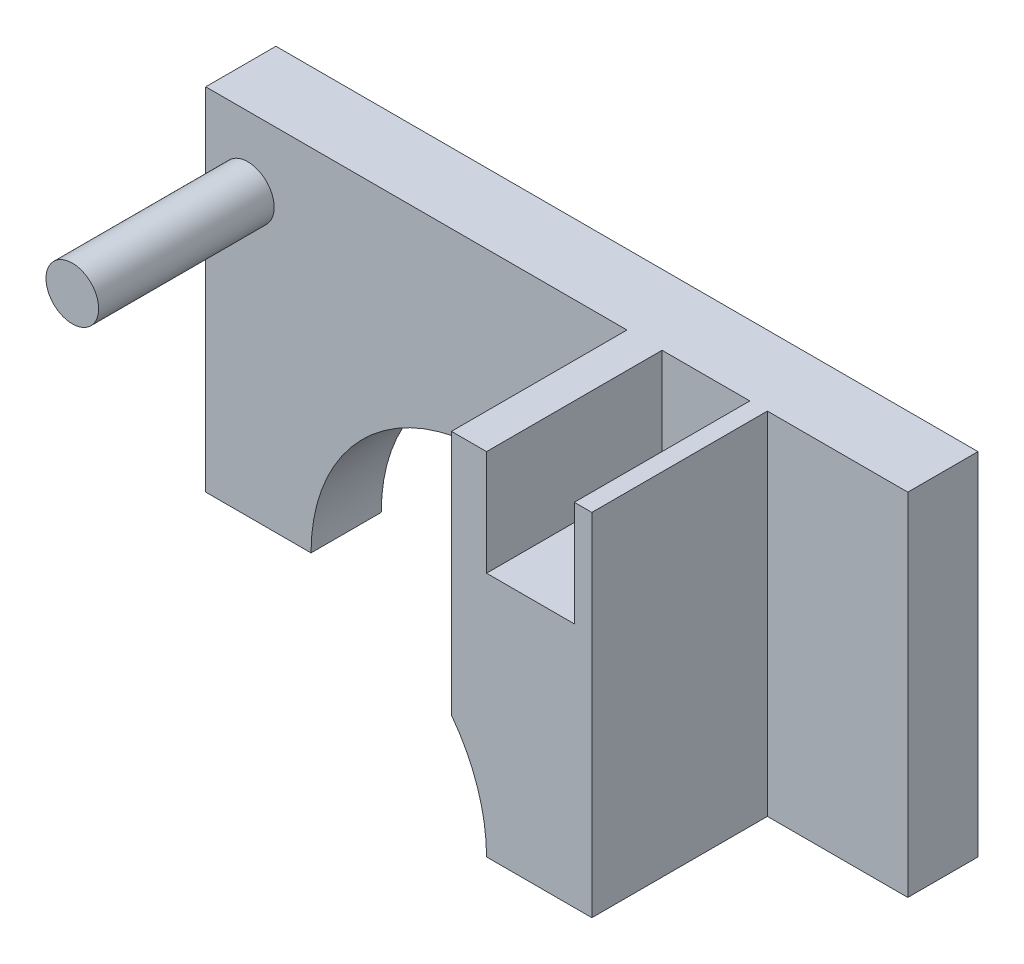
ISO-10303-21;
HEADER;
FILE_DESCRIPTION(('STEP AP214'),'2;1');
FILE_NAME('part.step','',(''),(''),'','','');
FILE_SCHEMA(('AUTOMOTIVE_DESIGN { 1 0 10303 214 1 1 1 1 }'));
ENDSEC;
DATA;
#1=APPLICATION_CONTEXT('core data for automotive mechanical design processes');
#2=APPLICATION_PROTOCOL_DEFINITION('international standard','automotive_design',2000,#1);
#3=PRODUCT_CONTEXT('',#1,'mechanical');
#4=PRODUCT('Part','Part','',(#3));
#5=PRODUCT_RELATED_PRODUCT_CATEGORY('part','',(#4));
#6=PRODUCT_DEFINITION_FORMATION('','',#4);
#7=PRODUCT_DEFINITION_CONTEXT('part definition',#1,'design');
#8=PRODUCT_DEFINITION('design','',#6,#7);
#9=PRODUCT_DEFINITION_SHAPE('','',#8);
#10=(LENGTH_UNIT() NAMED_UNIT(*) SI_UNIT(.MILLI.,.METRE.));
#11=(NAMED_UNIT(*) PLANE_ANGLE_UNIT() SI_UNIT($,.RADIAN.));
#12=(NAMED_UNIT(*) SI_UNIT($,.STERADIAN.) SOLID_ANGLE_UNIT());
#13=UNCERTAINTY_MEASURE_WITH_UNIT(LENGTH_MEASURE(1.E-05),#10,'distance_accuracy_value','');
#14=(GEOMETRIC_REPRESENTATION_CONTEXT(3) GLOBAL_UNCERTAINTY_ASSIGNED_CONTEXT((#13)) GLOBAL_UNIT_ASSIGNED_CONTEXT((#10,
#11,#12)) REPRESENTATION_CONTEXT('',''));
#15=CARTESIAN_POINT('',(0.,0.,0.));
#16=DIRECTION('',(0.,0.,1.));
#17=DIRECTION('',(1.,0.,0.));
#18=AXIS2_PLACEMENT_3D('',#15,#16,#17);
#19=CARTESIAN_POINT('',(0.,0.,20.));
#20=DIRECTION('',(0.,1.,0.));
#21=DIRECTION('',(0.,0.,1.));
#22=AXIS2_PLACEMENT_3D('',#19,#20,#21);
#23=PLANE('',#22);
#24=DIRECTION('',(1.,0.,0.));
#25=VECTOR('',#24,1.);
#26=CARTESIAN_POINT('',(120.,0.,70.));
#27=LINE('',#26,#25);
#28=CARTESIAN_POINT('',(130.,0.,70.));
#29=VERTEX_POINT('',#28);
#30=CARTESIAN_POINT('',(160.,0.,70.));
#31=VERTEX_POINT('',#30);
#32=EDGE_CURVE('E163',#29,#31,#27,.T.);
#33=ORIENTED_EDGE('',*,*,#32,.F.);
#34=DIRECTION('',(0.,0.,-1.));
#35=VECTOR('',#34,1.);
#36=CARTESIAN_POINT('',(130.,0.,211.42135623731));
#37=LINE('',#36,#35);
#38=CARTESIAN_POINT('',(130.,0.,0.));
#39=VERTEX_POINT('',#38);
#40=EDGE_CURVE('E55',#29,#39,#37,.T.);
#41=ORIENTED_EDGE('',*,*,#40,.T.);
#42=DIRECTION('',(1.,0.,0.));
#43=VECTOR('',#42,1.);
#44=CARTESIAN_POINT('',(0.,0.,0.));
#45=LINE('',#44,#43);
#46=CARTESIAN_POINT('',(200.,0.,0.));
#47=VERTEX_POINT('',#46);
#48=EDGE_CURVE('E232',#39,#47,#45,.T.);
#49=ORIENTED_EDGE('',*,*,#48,.T.);
#50=DIRECTION('',(0.,0.,-1.));
#51=VECTOR('',#50,1.);
#52=CARTESIAN_POINT('',(200.,0.,20.));
#53=LINE('',#52,#51);
#54=CARTESIAN_POINT('',(200.,0.,20.));
#55=VERTEX_POINT('',#54);
#56=EDGE_CURVE('E249',#55,#47,#53,.T.);
#57=ORIENTED_EDGE('',*,*,#56,.F.);
#58=DIRECTION('',(1.,0.,0.));
#59=VECTOR('',#58,1.);
#60=CARTESIAN_POINT('',(0.,0.,20.));
#61=LINE('',#60,#59);
#62=CARTESIAN_POINT('',(160.,0.,20.));
#63=VERTEX_POINT('',#62);
#64=EDGE_CURVE('E213',#63,#55,#61,.T.);
#65=ORIENTED_EDGE('',*,*,#64,.F.);
#66=DIRECTION('',(0.,0.,-1.));
#67=VECTOR('',#66,1.);
#68=CARTESIAN_POINT('',(160.,0.,70.));
#69=LINE('',#68,#67);
#70=EDGE_CURVE('E195',#31,#63,#69,.T.);
#71=ORIENTED_EDGE('',*,*,#70,.F.);
#72=EDGE_LOOP('',(#33,#41,#49,#57,#65,#71));
#73=FACE_BOUND('',#72,.T.);
#74=ADVANCED_FACE('F39',(#73),#23,.F.);
#75=CARTESIAN_POINT('',(0.,0.,20.));
#76=DIRECTION('',(0.,0.,-1.));
#77=DIRECTION('',(-1.,0.,0.));
#78=AXIS2_PLACEMENT_3D('',#75,#76,#77);
#79=PLANE('',#78);
#80=DIRECTION('',(0.,1.,0.));
#81=VECTOR('',#80,1.);
#82=CARTESIAN_POINT('',(160.,0.,20.));
#83=LINE('',#82,#81);
#84=CARTESIAN_POINT('',(160.,100.,20.));
#85=VERTEX_POINT('',#84);
#86=EDGE_CURVE('E185',#63,#85,#83,.T.);
#87=ORIENTED_EDGE('',*,*,#86,.F.);
#88=ORIENTED_EDGE('',*,*,#64,.T.);
#89=DIRECTION('',(0.,1.,0.));
#90=VECTOR('',#89,1.);
#91=CARTESIAN_POINT('',(200.,0.,20.));
#92=LINE('',#91,#90);
#93=CARTESIAN_POINT('',(200.,100.,20.));
#94=VERTEX_POINT('',#93);
#95=EDGE_CURVE('E219',#55,#94,#92,.T.);
#96=ORIENTED_EDGE('',*,*,#95,.T.);
#97=DIRECTION('',(-1.,0.,0.));
#98=VECTOR('',#97,1.);
#99=CARTESIAN_POINT('',(0.,100.,20.));
#100=LINE('',#99,#98);
#101=EDGE_CURVE('E223',#94,#85,#100,.T.);
#102=ORIENTED_EDGE('',*,*,#101,.T.);
#103=EDGE_LOOP('',(#87,#88,#96,#102));
#104=FACE_BOUND('',#103,.T.);
#105=ADVANCED_FACE('F337',(#104),#79,.F.);
#106=CARTESIAN_POINT('',(155.,100.,20.));
#107=VERTEX_POINT('',#106);
#108=CARTESIAN_POINT('',(130.,100.,20.));
#109=VERTEX_POINT('',#108);
#110=EDGE_CURVE('E228',#107,#109,#100,.T.);
#111=ORIENTED_EDGE('',*,*,#110,.T.);
#112=DIRECTION('',(0.,-1.,0.));
#113=VECTOR('',#112,1.);
#114=CARTESIAN_POINT('',(130.,100.,20.));
#115=LINE('',#114,#113);
#116=CARTESIAN_POINT('',(130.,70.,20.));
#117=VERTEX_POINT('',#116);
#118=EDGE_CURVE('E173',#109,#117,#115,.T.);
#119=ORIENTED_EDGE('',*,*,#118,.T.);
#120=DIRECTION('',(1.,0.,0.));
#121=VECTOR('',#120,1.);
#122=CARTESIAN_POINT('',(130.,70.,20.));
#123=LINE('',#122,#121);
#124=CARTESIAN_POINT('',(155.,70.,20.));
#125=VERTEX_POINT('',#124);
#126=EDGE_CURVE('E177',#117,#125,#123,.T.);
#127=ORIENTED_EDGE('',*,*,#126,.T.);
#128=DIRECTION('',(0.,-1.,0.));
#129=VECTOR('',#128,1.);
#130=CARTESIAN_POINT('',(155.,100.,20.));
#131=LINE('',#130,#129);
#132=EDGE_CURVE('E181',#107,#125,#131,.T.);
#133=ORIENTED_EDGE('',*,*,#132,.F.);
#134=EDGE_LOOP('',(#111,#119,#127,#133));
#135=FACE_BOUND('',#134,.T.);
#136=ADVANCED_FACE('F326',(#135),#79,.F.);
#137=CARTESIAN_POINT('',(0.,0.,20.));
#138=DIRECTION('',(1.,0.,0.));
#139=DIRECTION('',(0.,0.,-1.));
#140=AXIS2_PLACEMENT_3D('',#137,#138,#139);
#141=PLANE('',#140);
#142=DIRECTION('',(0.,-1.,0.));
#143=VECTOR('',#142,1.);
#144=CARTESIAN_POINT('',(0.,0.,0.));
#145=LINE('',#144,#143);
#146=CARTESIAN_POINT('',(0.,100.,0.));
#147=VERTEX_POINT('',#146);
#148=CARTESIAN_POINT('',(0.,0.,0.));
#149=VERTEX_POINT('',#148);
#150=EDGE_CURVE('E194',#147,#149,#145,.T.);
#151=ORIENTED_EDGE('',*,*,#150,.T.);
#152=DIRECTION('',(0.,0.,-1.));
#153=VECTOR('',#152,1.);
#154=CARTESIAN_POINT('',(0.,0.,20.));
#155=LINE('',#154,#153);
#156=CARTESIAN_POINT('',(0.,0.,20.));
#157=VERTEX_POINT('',#156);
#158=EDGE_CURVE('E48',#157,#149,#155,.T.);
#159=ORIENTED_EDGE('',*,*,#158,.F.);
#160=DIRECTION('',(0.,-1.,0.));
#161=VECTOR('',#160,1.);
#162=CARTESIAN_POINT('',(0.,0.,20.));
#163=LINE('',#162,#161);
#164=CARTESIAN_POINT('',(0.,100.,20.));
#165=VERTEX_POINT('',#164);
#166=EDGE_CURVE('E209',#165,#157,#163,.T.);
#167=ORIENTED_EDGE('',*,*,#166,.F.);
#168=DIRECTION('',(0.,0.,-1.));
#169=VECTOR('',#168,1.);
#170=CARTESIAN_POINT('',(0.,100.,20.));
#171=LINE('',#170,#169);
#172=EDGE_CURVE('E227',#165,#147,#171,.T.);
#173=ORIENTED_EDGE('',*,*,#172,.T.);
#174=EDGE_LOOP('',(#151,#159,#167,#173));
#175=FACE_BOUND('',#174,.T.);
#176=ADVANCED_FACE('F41',(#175),#141,.F.);
#177=CARTESIAN_POINT('',(30.,0.,0.));
#178=VERTEX_POINT('',#177);
#179=EDGE_CURVE('E233',#149,#178,#45,.T.);
#180=ORIENTED_EDGE('',*,*,#179,.T.);
#181=DIRECTION('',(0.,0.,-1.));
#182=VECTOR('',#181,1.);
#183=CARTESIAN_POINT('',(30.,0.,211.42135623731));
#184=LINE('',#183,#182);
#185=CARTESIAN_POINT('',(30.,0.,20.));
#186=VERTEX_POINT('',#185);
#187=EDGE_CURVE('E277',#178,#186,#184,.F.);
#188=ORIENTED_EDGE('',*,*,#187,.T.);
#189=EDGE_CURVE('E215',#157,#186,#61,.T.);
#190=ORIENTED_EDGE('',*,*,#189,.F.);
#191=ORIENTED_EDGE('',*,*,#158,.T.);
#192=EDGE_LOOP('',(#180,#188,#190,#191));
#193=FACE_BOUND('',#192,.T.);
#194=ADVANCED_FACE('F256',(#193),#23,.F.);
#195=CARTESIAN_POINT('',(200.,0.,20.));
#196=DIRECTION('',(-1.,0.,0.));
#197=DIRECTION('',(0.,0.,1.));
#198=AXIS2_PLACEMENT_3D('',#195,#196,#197);
#199=PLANE('',#198);
#200=DIRECTION('',(0.,1.,0.));
#201=VECTOR('',#200,1.);
#202=CARTESIAN_POINT('',(200.,0.,0.));
#203=LINE('',#202,#201);
#204=CARTESIAN_POINT('',(200.,100.,0.));
#205=VERTEX_POINT('',#204);
#206=EDGE_CURVE('E237',#47,#205,#203,.T.);
#207=ORIENTED_EDGE('',*,*,#206,.T.);
#208=DIRECTION('',(0.,0.,-1.));
#209=VECTOR('',#208,1.);
#210=CARTESIAN_POINT('',(200.,100.,20.));
#211=LINE('',#210,#209);
#212=EDGE_CURVE('E245',#94,#205,#211,.T.);
#213=ORIENTED_EDGE('',*,*,#212,.F.);
#214=ORIENTED_EDGE('',*,*,#95,.F.);
#215=ORIENTED_EDGE('',*,*,#56,.T.);
#216=EDGE_LOOP('',(#207,#213,#214,#215));
#217=FACE_BOUND('',#216,.T.);
#218=ADVANCED_FACE('F347',(#217),#199,.F.);
#219=CARTESIAN_POINT('',(0.,100.,20.));
#220=DIRECTION('',(0.,-1.,0.));
#221=DIRECTION('',(0.,0.,-1.));
#222=AXIS2_PLACEMENT_3D('',#219,#220,#221);
#223=PLANE('',#222);
#224=DIRECTION('',(-1.,0.,0.));
#225=VECTOR('',#224,1.);
#226=CARTESIAN_POINT('',(0.,100.,0.));
#227=LINE('',#226,#225);
#228=EDGE_CURVE('E214',#205,#147,#227,.T.);
#229=ORIENTED_EDGE('',*,*,#228,.T.);
#230=ORIENTED_EDGE('',*,*,#172,.F.);
#231=CARTESIAN_POINT('',(120.,100.,20.));
#232=VERTEX_POINT('',#231);
#233=EDGE_CURVE('E222',#232,#165,#100,.T.);
#234=ORIENTED_EDGE('',*,*,#233,.F.);
#235=DIRECTION('',(0.,0.,-1.));
#236=VECTOR('',#235,1.);
#237=CARTESIAN_POINT('',(120.,100.,70.));
#238=LINE('',#237,#236);
#239=CARTESIAN_POINT('',(120.,100.,70.));
#240=VERTEX_POINT('',#239);
#241=EDGE_CURVE('E191',#240,#232,#238,.T.);
#242=ORIENTED_EDGE('',*,*,#241,.F.);
#243=DIRECTION('',(1.,0.,0.));
#244=VECTOR('',#243,1.);
#245=CARTESIAN_POINT('',(120.,100.,70.));
#246=LINE('',#245,#244);
#247=CARTESIAN_POINT('',(130.,100.,70.));
#248=VERTEX_POINT('',#247);
#249=EDGE_CURVE('E160',#240,#248,#246,.T.);
#250=ORIENTED_EDGE('',*,*,#249,.T.);
#251=DIRECTION('',(0.,0.,-1.));
#252=VECTOR('',#251,1.);
#253=CARTESIAN_POINT('',(130.,100.,70.));
#254=LINE('',#253,#252);
#255=EDGE_CURVE('E162',#248,#109,#254,.T.);
#256=ORIENTED_EDGE('',*,*,#255,.T.);
#257=ORIENTED_EDGE('',*,*,#110,.F.);
#258=DIRECTION('',(0.,0.,-1.));
#259=VECTOR('',#258,1.);
#260=CARTESIAN_POINT('',(155.,100.,70.));
#261=LINE('',#260,#259);
#262=CARTESIAN_POINT('',(155.,100.,70.));
#263=VERTEX_POINT('',#262);
#264=EDGE_CURVE('E201',#263,#107,#261,.T.);
#265=ORIENTED_EDGE('',*,*,#264,.F.);
#266=DIRECTION('',(1.,0.,0.));
#267=VECTOR('',#266,1.);
#268=CARTESIAN_POINT('',(155.,100.,70.));
#269=LINE('',#268,#267);
#270=CARTESIAN_POINT('',(160.,100.,70.));
#271=VERTEX_POINT('',#270);
#272=EDGE_CURVE('E295',#263,#271,#269,.T.);
#273=ORIENTED_EDGE('',*,*,#272,.T.);
#274=DIRECTION('',(0.,0.,-1.));
#275=VECTOR('',#274,1.);
#276=CARTESIAN_POINT('',(160.,100.,70.));
#277=LINE('',#276,#275);
#278=EDGE_CURVE('E198',#271,#85,#277,.T.);
#279=ORIENTED_EDGE('',*,*,#278,.T.);
#280=ORIENTED_EDGE('',*,*,#101,.F.);
#281=ORIENTED_EDGE('',*,*,#212,.T.);
#282=EDGE_LOOP('',(#229,#230,#234,#242,#250,#256,#257,#265,#273,#279,#280,#281));
#283=FACE_BOUND('',#282,.T.);
#284=ADVANCED_FACE('F308',(#283),#223,.F.);
#285=CARTESIAN_POINT('',(12.,80.,20.));
#286=DIRECTION('',(0.,0.,-1.));
#287=DIRECTION('',(-1.,0.,0.));
#288=AXIS2_PLACEMENT_3D('',#285,#286,#287);
#289=CIRCLE('',#288,7.5);
#290=CARTESIAN_POINT('',(4.5,80.,20.));
#291=VERTEX_POINT('',#290);
#292=EDGE_CURVE('E11',#291,#291,#289,.F.);
#293=ORIENTED_EDGE('',*,*,#292,.F.);
#294=EDGE_LOOP('',(#293));
#295=FACE_BOUND('',#294,.T.);
#296=ORIENTED_EDGE('',*,*,#189,.T.);
#297=CARTESIAN_POINT('',(80.,0.,20.));
#298=DIRECTION('',(0.,0.,-1.));
#299=DIRECTION('',(-1.,0.,0.));
#300=AXIS2_PLACEMENT_3D('',#297,#298,#299);
#301=CIRCLE('',#300,50.);
#302=CARTESIAN_POINT('',(120.,30.,20.));
#303=VERTEX_POINT('',#302);
#304=EDGE_CURVE('E154',#186,#303,#301,.T.);
#305=ORIENTED_EDGE('',*,*,#304,.T.);
#306=DIRECTION('',(0.,1.,0.));
#307=VECTOR('',#306,1.);
#308=CARTESIAN_POINT('',(120.,0.,20.));
#309=LINE('',#308,#307);
#310=EDGE_CURVE('E63',#303,#232,#309,.T.);
#311=ORIENTED_EDGE('',*,*,#310,.T.);
#312=ORIENTED_EDGE('',*,*,#233,.T.);
#313=ORIENTED_EDGE('',*,*,#166,.T.);
#314=EDGE_LOOP('',(#296,#305,#311,#312,#313));
#315=FACE_BOUND('',#314,.T.);
#316=ADVANCED_FACE('F344',(#295,#315),#79,.F.);
#317=CARTESIAN_POINT('',(0.,0.,0.));
#318=DIRECTION('',(0.,0.,-1.));
#319=DIRECTION('',(-1.,0.,0.));
#320=AXIS2_PLACEMENT_3D('',#317,#318,#319);
#321=PLANE('',#320);
#322=CARTESIAN_POINT('',(80.,0.,0.));
#323=DIRECTION('',(0.,0.,-1.));
#324=DIRECTION('',(-1.,0.,0.));
#325=AXIS2_PLACEMENT_3D('',#322,#323,#324);
#326=CIRCLE('',#325,50.);
#327=EDGE_CURVE('E147',#178,#39,#326,.T.);
#328=ORIENTED_EDGE('',*,*,#327,.F.);
#329=ORIENTED_EDGE('',*,*,#179,.F.);
#330=ORIENTED_EDGE('',*,*,#150,.F.);
#331=ORIENTED_EDGE('',*,*,#228,.F.);
#332=ORIENTED_EDGE('',*,*,#206,.F.);
#333=ORIENTED_EDGE('',*,*,#48,.F.);
#334=EDGE_LOOP('',(#328,#329,#330,#331,#332,#333));
#335=FACE_BOUND('',#334,.T.);
#336=ADVANCED_FACE('F265',(#335),#321,.T.);
#337=CARTESIAN_POINT('',(120.,0.,70.));
#338=DIRECTION('',(-1.,0.,0.));
#339=DIRECTION('',(0.,0.,1.));
#340=AXIS2_PLACEMENT_3D('',#337,#338,#339);
#341=PLANE('',#340);
#342=DIRECTION('',(0.,0.,-1.));
#343=VECTOR('',#342,1.);
#344=CARTESIAN_POINT('',(120.,30.,211.42135623731));
#345=LINE('',#344,#343);
#346=CARTESIAN_POINT('',(120.,30.,70.));
#347=VERTEX_POINT('',#346);
#348=EDGE_CURVE('E142',#347,#303,#345,.T.);
#349=ORIENTED_EDGE('',*,*,#348,.F.);
#350=DIRECTION('',(0.,1.,0.));
#351=VECTOR('',#350,1.);
#352=CARTESIAN_POINT('',(120.,0.,70.));
#353=LINE('',#352,#351);
#354=EDGE_CURVE('E151',#347,#240,#353,.T.);
#355=ORIENTED_EDGE('',*,*,#354,.T.);
#356=ORIENTED_EDGE('',*,*,#241,.T.);
#357=ORIENTED_EDGE('',*,*,#310,.F.);
#358=EDGE_LOOP('',(#349,#355,#356,#357));
#359=FACE_BOUND('',#358,.T.);
#360=ADVANCED_FACE('F150',(#359),#341,.T.);
#361=CARTESIAN_POINT('',(160.,0.,70.));
#362=DIRECTION('',(-1.,0.,0.));
#363=DIRECTION('',(0.,0.,1.));
#364=AXIS2_PLACEMENT_3D('',#361,#362,#363);
#365=PLANE('',#364);
#366=ORIENTED_EDGE('',*,*,#86,.T.);
#367=ORIENTED_EDGE('',*,*,#278,.F.);
#368=DIRECTION('',(0.,1.,0.));
#369=VECTOR('',#368,1.);
#370=CARTESIAN_POINT('',(160.,0.,70.));
#371=LINE('',#370,#369);
#372=EDGE_CURVE('E169',#31,#271,#371,.T.);
#373=ORIENTED_EDGE('',*,*,#372,.F.);
#374=ORIENTED_EDGE('',*,*,#70,.T.);
#375=EDGE_LOOP('',(#366,#367,#373,#374));
#376=FACE_BOUND('',#375,.T.);
#377=ADVANCED_FACE('F304',(#376),#365,.F.);
#378=CARTESIAN_POINT('',(155.,100.,70.));
#379=DIRECTION('',(1.,0.,0.));
#380=DIRECTION('',(0.,0.,-1.));
#381=AXIS2_PLACEMENT_3D('',#378,#379,#380);
#382=PLANE('',#381);
#383=ORIENTED_EDGE('',*,*,#132,.T.);
#384=DIRECTION('',(0.,0.,-1.));
#385=VECTOR('',#384,1.);
#386=CARTESIAN_POINT('',(155.,70.,70.));
#387=LINE('',#386,#385);
#388=CARTESIAN_POINT('',(155.,70.,70.));
#389=VERTEX_POINT('',#388);
#390=EDGE_CURVE('E204',#389,#125,#387,.T.);
#391=ORIENTED_EDGE('',*,*,#390,.F.);
#392=DIRECTION('',(0.,-1.,0.));
#393=VECTOR('',#392,1.);
#394=CARTESIAN_POINT('',(155.,100.,70.));
#395=LINE('',#394,#393);
#396=EDGE_CURVE('E292',#263,#389,#395,.T.);
#397=ORIENTED_EDGE('',*,*,#396,.F.);
#398=ORIENTED_EDGE('',*,*,#264,.T.);
#399=EDGE_LOOP('',(#383,#391,#397,#398));
#400=FACE_BOUND('',#399,.T.);
#401=ADVANCED_FACE('F315',(#400),#382,.F.);
#402=CARTESIAN_POINT('',(130.,70.,70.));
#403=DIRECTION('',(0.,1.,0.));
#404=DIRECTION('',(0.,0.,1.));
#405=AXIS2_PLACEMENT_3D('',#402,#403,#404);
#406=PLANE('',#405);
#407=ORIENTED_EDGE('',*,*,#126,.F.);
#408=DIRECTION('',(0.,0.,-1.));
#409=VECTOR('',#408,1.);
#410=CARTESIAN_POINT('',(130.,70.,70.));
#411=LINE('',#410,#409);
#412=CARTESIAN_POINT('',(130.,70.,70.));
#413=VERTEX_POINT('',#412);
#414=EDGE_CURVE('E167',#413,#117,#411,.T.);
#415=ORIENTED_EDGE('',*,*,#414,.F.);
#416=DIRECTION('',(1.,0.,0.));
#417=VECTOR('',#416,1.);
#418=CARTESIAN_POINT('',(130.,70.,70.));
#419=LINE('',#418,#417);
#420=EDGE_CURVE('E288',#413,#389,#419,.T.);
#421=ORIENTED_EDGE('',*,*,#420,.T.);
#422=ORIENTED_EDGE('',*,*,#390,.T.);
#423=EDGE_LOOP('',(#407,#415,#421,#422));
#424=FACE_BOUND('',#423,.T.);
#425=ADVANCED_FACE('F327',(#424),#406,.T.);
#426=CARTESIAN_POINT('',(130.,100.,70.));
#427=DIRECTION('',(1.,0.,0.));
#428=DIRECTION('',(0.,0.,-1.));
#429=AXIS2_PLACEMENT_3D('',#426,#427,#428);
#430=PLANE('',#429);
#431=ORIENTED_EDGE('',*,*,#118,.F.);
#432=ORIENTED_EDGE('',*,*,#255,.F.);
#433=DIRECTION('',(0.,-1.,0.));
#434=VECTOR('',#433,1.);
#435=CARTESIAN_POINT('',(130.,100.,70.));
#436=LINE('',#435,#434);
#437=EDGE_CURVE('E284',#248,#413,#436,.T.);
#438=ORIENTED_EDGE('',*,*,#437,.T.);
#439=ORIENTED_EDGE('',*,*,#414,.T.);
#440=EDGE_LOOP('',(#431,#432,#438,#439));
#441=FACE_BOUND('',#440,.T.);
#442=ADVANCED_FACE('F320',(#441),#430,.T.);
#443=CARTESIAN_POINT('',(0.,0.,70.));
#444=DIRECTION('',(0.,0.,-1.));
#445=DIRECTION('',(-1.,0.,0.));
#446=AXIS2_PLACEMENT_3D('',#443,#444,#445);
#447=PLANE('',#446);
#448=ORIENTED_EDGE('',*,*,#354,.F.);
#449=CARTESIAN_POINT('',(80.,0.,70.));
#450=DIRECTION('',(0.,0.,-1.));
#451=DIRECTION('',(-1.,0.,0.));
#452=AXIS2_PLACEMENT_3D('',#449,#450,#451);
#453=CIRCLE('',#452,50.);
#454=EDGE_CURVE('E139',#29,#347,#453,.F.);
#455=ORIENTED_EDGE('',*,*,#454,.F.);
#456=ORIENTED_EDGE('',*,*,#32,.T.);
#457=ORIENTED_EDGE('',*,*,#372,.T.);
#458=ORIENTED_EDGE('',*,*,#272,.F.);
#459=ORIENTED_EDGE('',*,*,#396,.T.);
#460=ORIENTED_EDGE('',*,*,#420,.F.);
#461=ORIENTED_EDGE('',*,*,#437,.F.);
#462=ORIENTED_EDGE('',*,*,#249,.F.);
#463=EDGE_LOOP('',(#448,#455,#456,#457,#458,#459,#460,#461,#462));
#464=FACE_BOUND('',#463,.T.);
#465=ADVANCED_FACE('F157',(#464),#447,.F.);
#466=CARTESIAN_POINT('',(80.,0.,211.42135623731));
#467=DIRECTION('',(0.,0.,-1.));
#468=DIRECTION('',(-1.,0.,0.));
#469=AXIS2_PLACEMENT_3D('',#466,#467,#468);
#470=CYLINDRICAL_SURFACE('',#469,50.);
#471=ORIENTED_EDGE('',*,*,#454,.T.);
#472=ORIENTED_EDGE('',*,*,#348,.T.);
#473=ORIENTED_EDGE('',*,*,#304,.F.);
#474=ORIENTED_EDGE('',*,*,#187,.F.);
#475=ORIENTED_EDGE('',*,*,#327,.T.);
#476=ORIENTED_EDGE('',*,*,#40,.F.);
#477=EDGE_LOOP('',(#471,#472,#473,#474,#475,#476));
#478=FACE_BOUND('',#477,.T.);
#479=ADVANCED_FACE('F141',(#478),#470,.F.);
#480=CARTESIAN_POINT('',(12.,80.,70.));
#481=DIRECTION('',(0.,0.,-1.));
#482=DIRECTION('',(-1.,0.,0.));
#483=AXIS2_PLACEMENT_3D('',#480,#481,#482);
#484=CYLINDRICAL_SURFACE('',#483,7.5);
#485=CARTESIAN_POINT('',(12.,80.,70.));
#486=DIRECTION('',(0.,0.,1.));
#487=DIRECTION('',(1.,0.,0.));
#488=AXIS2_PLACEMENT_3D('',#485,#486,#487);
#489=CIRCLE('',#488,7.5);
#490=CARTESIAN_POINT('',(4.5,80.,70.));
#491=VERTEX_POINT('',#490);
#492=EDGE_CURVE('E269',#491,#491,#489,.T.);
#493=CARTESIAN_POINT('',(4.5,80.,70.));
#494=CARTESIAN_POINT('',(4.5,80.,69.4791666666667));
#495=CARTESIAN_POINT('',(4.5,80.,68.9583333333333));
#496=CARTESIAN_POINT('',(4.5,80.,67.9166666666667));
#497=CARTESIAN_POINT('',(4.5,80.,67.3958333333333));
#498=CARTESIAN_POINT('',(4.5,80.,66.3541666666667));
#499=CARTESIAN_POINT('',(4.5,80.,65.8333333333333));
#500=CARTESIAN_POINT('',(4.5,80.,64.7916666666667));
#501=CARTESIAN_POINT('',(4.5,80.,64.2708333333333));
#502=CARTESIAN_POINT('',(4.5,80.,63.2291666666667));
#503=CARTESIAN_POINT('',(4.5,80.,62.7083333333333));
#504=CARTESIAN_POINT('',(4.5,80.,61.6666666666667));
#505=CARTESIAN_POINT('',(4.5,80.,61.1458333333333));
#506=CARTESIAN_POINT('',(4.5,80.,60.1041666666667));
#507=CARTESIAN_POINT('',(4.5,80.,59.5833333333333));
#508=CARTESIAN_POINT('',(4.5,80.,58.5416666666667));
#509=CARTESIAN_POINT('',(4.5,80.,58.0208333333333));
#510=CARTESIAN_POINT('',(4.5,80.,56.9791666666667));
#511=CARTESIAN_POINT('',(4.5,80.,56.4583333333333));
#512=CARTESIAN_POINT('',(4.5,80.,55.4166666666667));
#513=CARTESIAN_POINT('',(4.5,80.,54.8958333333333));
#514=CARTESIAN_POINT('',(4.5,80.,53.8541666666667));
#515=CARTESIAN_POINT('',(4.5,80.,53.3333333333333));
#516=CARTESIAN_POINT('',(4.5,80.,52.2916666666667));
#517=CARTESIAN_POINT('',(4.5,80.,51.7708333333333));
#518=CARTESIAN_POINT('',(4.5,80.,50.7291666666667));
#519=CARTESIAN_POINT('',(4.5,80.,50.2083333333333));
#520=CARTESIAN_POINT('',(4.5,80.,49.1666666666667));
#521=CARTESIAN_POINT('',(4.5,80.,48.6458333333333));
#522=CARTESIAN_POINT('',(4.5,80.,47.6041666666667));
#523=CARTESIAN_POINT('',(4.5,80.,47.0833333333333));
#524=CARTESIAN_POINT('',(4.5,80.,46.0416666666667));
#525=CARTESIAN_POINT('',(4.5,80.,45.5208333333333));
#526=CARTESIAN_POINT('',(4.5,80.,44.4791666666667));
#527=CARTESIAN_POINT('',(4.5,80.,43.9583333333333));
#528=CARTESIAN_POINT('',(4.5,80.,42.9166666666667));
#529=CARTESIAN_POINT('',(4.5,80.,42.3958333333333));
#530=CARTESIAN_POINT('',(4.5,80.,41.3541666666667));
#531=CARTESIAN_POINT('',(4.5,80.,40.8333333333333));
#532=CARTESIAN_POINT('',(4.5,80.,39.7916666666667));
#533=CARTESIAN_POINT('',(4.5,80.,39.2708333333333));
#534=CARTESIAN_POINT('',(4.5,80.,38.2291666666667));
#535=CARTESIAN_POINT('',(4.5,80.,37.7083333333333));
#536=CARTESIAN_POINT('',(4.5,80.,36.6666666666667));
#537=CARTESIAN_POINT('',(4.5,80.,36.1458333333333));
#538=CARTESIAN_POINT('',(4.5,80.,35.1041666666667));
#539=CARTESIAN_POINT('',(4.5,80.,34.5833333333333));
#540=CARTESIAN_POINT('',(4.5,80.,33.5416666666667));
#541=CARTESIAN_POINT('',(4.5,80.,33.0208333333333));
#542=CARTESIAN_POINT('',(4.5,80.,31.9791666666667));
#543=CARTESIAN_POINT('',(4.5,80.,31.4583333333333));
#544=CARTESIAN_POINT('',(4.5,80.,30.4166666666667));
#545=CARTESIAN_POINT('',(4.5,80.,29.8958333333333));
#546=CARTESIAN_POINT('',(4.5,80.,28.8541666666667));
#547=CARTESIAN_POINT('',(4.5,80.,28.3333333333333));
#548=CARTESIAN_POINT('',(4.5,80.,27.2916666666667));
#549=CARTESIAN_POINT('',(4.5,80.,26.7708333333333));
#550=CARTESIAN_POINT('',(4.5,80.,25.7291666666667));
#551=CARTESIAN_POINT('',(4.5,80.,25.2083333333333));
#552=CARTESIAN_POINT('',(4.5,80.,24.1666666666667));
#553=CARTESIAN_POINT('',(4.5,80.,23.6458333333333));
#554=CARTESIAN_POINT('',(4.5,80.,22.6041666666667));
#555=CARTESIAN_POINT('',(4.5,80.,22.0833333333333));
#556=CARTESIAN_POINT('',(4.5,80.,21.0416666666667));
#557=CARTESIAN_POINT('',(4.5,80.,20.5208333333333));
#558=CARTESIAN_POINT('',(4.5,80.,20.));
#559=B_SPLINE_CURVE_WITH_KNOTS('',3,(#493,#494,#495,#496,#497,#498,#499,#500,#501,#502,#503,
#504,#505,#506,#507,#508,#509,#510,#511,#512,#513,#514,#515,#516,#517,#518,#519,#520,#521,#522,
#523,#524,#525,#526,#527,#528,#529,#530,#531,#532,#533,#534,#535,#536,#537,#538,#539,#540,#541,
#542,#543,#544,#545,#546,#547,#548,#549,#550,#551,#552,#553,#554,#555,#556,#557,#558),
.UNSPECIFIED.,.F.,.F.,(4,2,2,2,2,2,2,2,2,2,2,2,2,2,2,2,2,2,2,2,2,2,2,2,2,2,2,2,2,2,2,2,4),(0.,
1.56249999999999,3.12499999999999,4.6875,6.24999999999999,7.81249999999999,9.37499999999999,
10.9375,12.5,14.0625,15.625,17.1875,18.75,20.3125,21.875,23.4375,25.,26.5625,28.125,29.6875,
31.25,32.8125,34.375,35.9375,37.5,39.0625,40.625,42.1875,43.75,45.3125,46.875,48.4375,50.),.UNSPECIFIED.);
#560=EDGE_CURVE('BSEAM368',#491,#291,#559,.T.);
#561=ORIENTED_EDGE('',*,*,#492,.F.);
#562=ORIENTED_EDGE('',*,*,#292,.T.);
#563=ORIENTED_EDGE('',*,*,#560,.T.);
#564=ORIENTED_EDGE('',*,*,#560,.F.);
#565=EDGE_LOOP('',(#561,#563,#562,#564));
#566=FACE_BOUND('',#565,.T.);
#567=ADVANCED_FACE('F368',(#566),#484,.T.);
#568=CARTESIAN_POINT('',(12.,80.,70.));
#569=DIRECTION('',(0.,0.,1.));
#570=DIRECTION('',(1.,0.,0.));
#571=AXIS2_PLACEMENT_3D('',#568,#569,#570);
#572=PLANE('',#571);
#573=ORIENTED_EDGE('',*,*,#492,.T.);
#574=EDGE_LOOP('',(#573));
#575=FACE_BOUND('',#574,.T.);
#576=ADVANCED_FACE('F370',(#575),#572,.T.);
#577=CLOSED_SHELL('',(#74,#105,#136,#176,#194,#218,#284,#316,#336,#360,#377,#401,#425,#442,#465,
#479,#567,#576));
#578=MANIFOLD_SOLID_BREP('B2',#577);
#579=ADVANCED_BREP_SHAPE_REPRESENTATION('',(#18,#578),#14);
#580=SHAPE_DEFINITION_REPRESENTATION(#9,#579);
ENDSEC;
END-ISO-10303-21;
